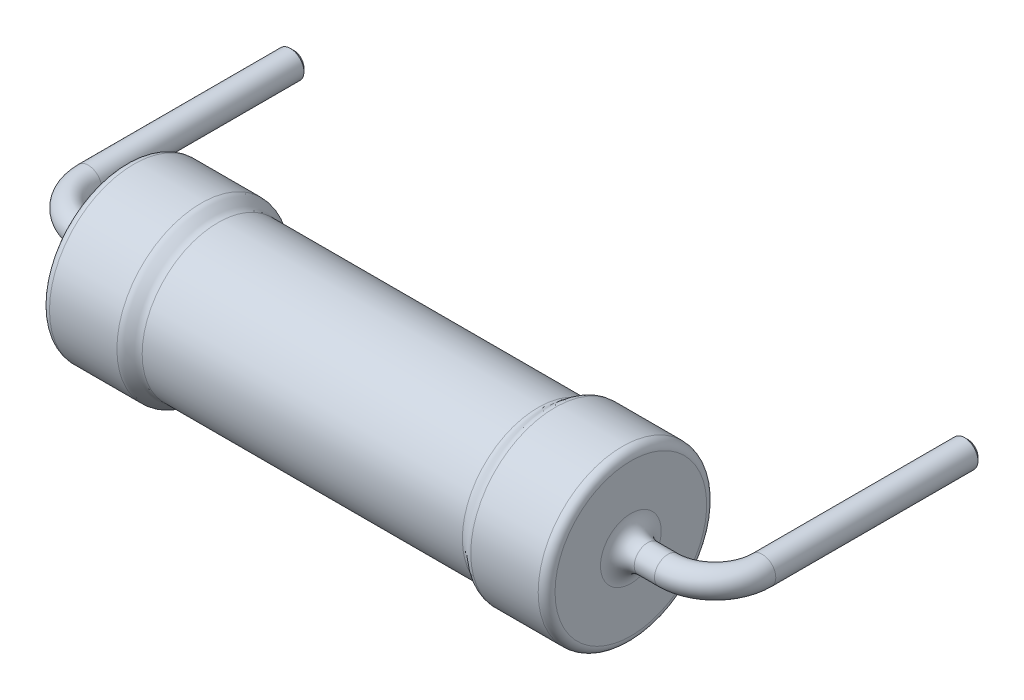
ISO-10303-21;
HEADER;
FILE_DESCRIPTION(('STEP AP214'),'2;1');
FILE_NAME('part.step','',(''),(''),'','','');
FILE_SCHEMA(('AUTOMOTIVE_DESIGN { 1 0 10303 214 1 1 1 1 }'));
ENDSEC;
DATA;
#1=APPLICATION_CONTEXT('core data for automotive mechanical design processes');
#2=APPLICATION_PROTOCOL_DEFINITION('international standard','automotive_design',2000,#1);
#3=PRODUCT_CONTEXT('',#1,'mechanical');
#4=PRODUCT('Part','Part','',(#3));
#5=PRODUCT_RELATED_PRODUCT_CATEGORY('part','',(#4));
#6=PRODUCT_DEFINITION_FORMATION('','',#4);
#7=PRODUCT_DEFINITION_CONTEXT('part definition',#1,'design');
#8=PRODUCT_DEFINITION('design','',#6,#7);
#9=PRODUCT_DEFINITION_SHAPE('','',#8);
#10=(LENGTH_UNIT() NAMED_UNIT(*) SI_UNIT(.MILLI.,.METRE.));
#11=(NAMED_UNIT(*) PLANE_ANGLE_UNIT() SI_UNIT($,.RADIAN.));
#12=(NAMED_UNIT(*) SI_UNIT($,.STERADIAN.) SOLID_ANGLE_UNIT());
#13=UNCERTAINTY_MEASURE_WITH_UNIT(LENGTH_MEASURE(1.E-05),#10,'distance_accuracy_value','');
#14=(GEOMETRIC_REPRESENTATION_CONTEXT(3) GLOBAL_UNCERTAINTY_ASSIGNED_CONTEXT((#13)) GLOBAL_UNIT_ASSIGNED_CONTEXT((#10,
#11,#12)) REPRESENTATION_CONTEXT('',''));
#15=CARTESIAN_POINT('',(0.,0.,0.));
#16=DIRECTION('',(0.,0.,1.));
#17=DIRECTION('',(1.,0.,0.));
#18=AXIS2_PLACEMENT_3D('',#15,#16,#17);
#19=CARTESIAN_POINT('',(8.,0.,4.5));
#20=DIRECTION('',(-1.,0.,0.));
#21=DIRECTION('',(0.,0.,1.));
#22=AXIS2_PLACEMENT_3D('',#19,#20,#21);
#23=TOROIDAL_SURFACE('',#22,0.899999999999999,0.499999999999999);
#24=CARTESIAN_POINT('',(7.5,0.,4.5));
#25=DIRECTION('',(-1.,0.,0.));
#26=DIRECTION('',(0.,0.,1.));
#27=AXIS2_PLACEMENT_3D('',#24,#25,#26);
#28=CIRCLE('',#27,0.9);
#29=CARTESIAN_POINT('',(7.5,0.,5.4));
#30=VERTEX_POINT('',#29);
#31=EDGE_CURVE('E54',#30,#30,#28,.T.);
#32=ORIENTED_EDGE('',*,*,#31,.F.);
#33=EDGE_LOOP('',(#32));
#34=FACE_BOUND('',#33,.T.);
#35=CARTESIAN_POINT('',(8.,0.,4.5));
#36=DIRECTION('',(-1.,0.,0.));
#37=DIRECTION('',(0.,0.,1.));
#38=AXIS2_PLACEMENT_3D('',#35,#36,#37);
#39=CIRCLE('',#38,0.4);
#40=CARTESIAN_POINT('',(8.,0.,4.9));
#41=VERTEX_POINT('',#40);
#42=EDGE_CURVE('E195',#41,#41,#39,.F.);
#43=ORIENTED_EDGE('',*,*,#42,.F.);
#44=EDGE_LOOP('',(#43));
#45=FACE_BOUND('',#44,.T.);
#46=ADVANCED_FACE('F34',(#34,#45),#23,.F.);
#47=CARTESIAN_POINT('',(7.5,0.,3.6));
#48=DIRECTION('',(-1.,0.,0.));
#49=DIRECTION('',(0.,0.,1.));
#50=AXIS2_PLACEMENT_3D('',#47,#48,#49);
#51=PLANE('',#50);
#52=CARTESIAN_POINT('',(7.5,0.,4.5));
#53=DIRECTION('',(-1.,0.,0.));
#54=DIRECTION('',(0.,0.,1.));
#55=AXIS2_PLACEMENT_3D('',#52,#53,#54);
#56=CIRCLE('',#55,2.25);
#57=CARTESIAN_POINT('',(7.5,0.,6.75));
#58=VERTEX_POINT('',#57);
#59=EDGE_CURVE('E62',#58,#58,#56,.T.);
#60=ORIENTED_EDGE('',*,*,#59,.F.);
#61=EDGE_LOOP('',(#60));
#62=FACE_BOUND('',#61,.T.);
#63=ORIENTED_EDGE('',*,*,#31,.T.);
#64=EDGE_LOOP('',(#63));
#65=FACE_BOUND('',#64,.T.);
#66=ADVANCED_FACE('F122',(#62,#65),#51,.F.);
#67=CARTESIAN_POINT('',(7.25,0.,4.5));
#68=DIRECTION('',(-1.,0.,0.));
#69=DIRECTION('',(0.,0.,1.));
#70=AXIS2_PLACEMENT_3D('',#67,#68,#69);
#71=TOROIDAL_SURFACE('',#70,2.25,0.250000000000001);
#72=CARTESIAN_POINT('',(7.25,0.,4.5));
#73=DIRECTION('',(-1.,0.,0.));
#74=DIRECTION('',(0.,0.,1.));
#75=AXIS2_PLACEMENT_3D('',#72,#73,#74);
#76=CIRCLE('',#75,2.5);
#77=CARTESIAN_POINT('',(7.25,0.,7.));
#78=VERTEX_POINT('',#77);
#79=EDGE_CURVE('E65',#78,#78,#76,.T.);
#80=ORIENTED_EDGE('',*,*,#79,.F.);
#81=EDGE_LOOP('',(#80));
#82=FACE_BOUND('',#81,.T.);
#83=ORIENTED_EDGE('',*,*,#59,.T.);
#84=EDGE_LOOP('',(#83));
#85=FACE_BOUND('',#84,.T.);
#86=ADVANCED_FACE('F118',(#82,#85),#71,.T.);
#87=CARTESIAN_POINT('',(-11.456266602372,0.,4.5));
#88=DIRECTION('',(-1.,0.,0.));
#89=DIRECTION('',(0.,0.,1.));
#90=AXIS2_PLACEMENT_3D('',#87,#88,#89);
#91=CYLINDRICAL_SURFACE('',#90,2.5);
#92=CARTESIAN_POINT('',(5.25,0.,4.5));
#93=DIRECTION('',(-1.,0.,0.));
#94=DIRECTION('',(0.,0.,1.));
#95=AXIS2_PLACEMENT_3D('',#92,#93,#94);
#96=CIRCLE('',#95,2.5);
#97=CARTESIAN_POINT('',(5.25,0.,7.));
#98=VERTEX_POINT('',#97);
#99=EDGE_CURVE('E68',#98,#98,#96,.T.);
#100=ORIENTED_EDGE('',*,*,#99,.F.);
#101=EDGE_LOOP('',(#100));
#102=FACE_BOUND('',#101,.T.);
#103=ORIENTED_EDGE('',*,*,#79,.T.);
#104=EDGE_LOOP('',(#103));
#105=FACE_BOUND('',#104,.T.);
#106=ADVANCED_FACE('F114',(#102,#105),#91,.T.);
#107=CARTESIAN_POINT('',(5.25,0.,2.));
#108=CARTESIAN_POINT('',(5.13848377130945,0.,2.));
#109=CARTESIAN_POINT('',(5.00120875504425,0.,2.125));
#110=CARTESIAN_POINT('',(4.85909871860205,0.,2.25));
#111=CARTESIAN_POINT('',(4.75,0.,2.25));
#112=B_SPLINE_CURVE_WITH_KNOTS('',3,(#107,#108,#109,#110,#111),.UNSPECIFIED.,.F.,.F.,(4,1,4),
(0.,0.500000000000001,1.),.UNSPECIFIED.);
#113=CARTESIAN_POINT('',(-11.456266602372,0.,4.5));
#114=DIRECTION('',(-1.,0.,0.));
#115=AXIS1_PLACEMENT('',#113,#114);
#116=SURFACE_OF_REVOLUTION('',#112,#115);
#117=CARTESIAN_POINT('',(4.75,0.,4.5));
#118=DIRECTION('',(-1.,0.,0.));
#119=DIRECTION('',(0.,0.,1.));
#120=AXIS2_PLACEMENT_3D('',#117,#118,#119);
#121=CIRCLE('',#120,2.25);
#122=CARTESIAN_POINT('',(4.75,0.,6.75));
#123=VERTEX_POINT('',#122);
#124=EDGE_CURVE('E71',#123,#123,#121,.T.);
#125=ORIENTED_EDGE('',*,*,#124,.F.);
#126=EDGE_LOOP('',(#125));
#127=FACE_BOUND('',#126,.T.);
#128=ORIENTED_EDGE('',*,*,#99,.T.);
#129=EDGE_LOOP('',(#128));
#130=FACE_BOUND('',#129,.T.);
#131=ADVANCED_FACE('F110',(#127,#130),#116,.T.);
#132=CARTESIAN_POINT('',(-11.456266602372,0.,4.5));
#133=DIRECTION('',(-1.,0.,0.));
#134=DIRECTION('',(0.,0.,1.));
#135=AXIS2_PLACEMENT_3D('',#132,#133,#134);
#136=CYLINDRICAL_SURFACE('',#135,2.25);
#137=CARTESIAN_POINT('',(-4.75,0.,4.5));
#138=DIRECTION('',(-1.,0.,0.));
#139=DIRECTION('',(0.,0.,1.));
#140=AXIS2_PLACEMENT_3D('',#137,#138,#139);
#141=CIRCLE('',#140,2.25);
#142=CARTESIAN_POINT('',(-4.75,0.,6.75));
#143=VERTEX_POINT('',#142);
#144=EDGE_CURVE('E74',#143,#143,#141,.T.);
#145=ORIENTED_EDGE('',*,*,#144,.F.);
#146=EDGE_LOOP('',(#145));
#147=FACE_BOUND('',#146,.T.);
#148=ORIENTED_EDGE('',*,*,#124,.T.);
#149=EDGE_LOOP('',(#148));
#150=FACE_BOUND('',#149,.T.);
#151=ADVANCED_FACE('F105',(#147,#150),#136,.T.);
#152=CARTESIAN_POINT('',(-4.75,0.,2.25));
#153=CARTESIAN_POINT('',(-4.85909871860204,0.,2.25));
#154=CARTESIAN_POINT('',(-5.00120875504425,0.,2.125));
#155=CARTESIAN_POINT('',(-5.13848377130945,0.,2.));
#156=CARTESIAN_POINT('',(-5.25,0.,2.));
#157=B_SPLINE_CURVE_WITH_KNOTS('',3,(#152,#153,#154,#155,#156),.UNSPECIFIED.,.F.,.F.,(4,1,4),
(0.,0.5,1.),.UNSPECIFIED.);
#158=CARTESIAN_POINT('',(-11.456266602372,0.,4.5));
#159=DIRECTION('',(-1.,0.,0.));
#160=AXIS1_PLACEMENT('',#158,#159);
#161=SURFACE_OF_REVOLUTION('',#157,#160);
#162=CARTESIAN_POINT('',(-5.25,0.,4.5));
#163=DIRECTION('',(-1.,0.,0.));
#164=DIRECTION('',(0.,0.,1.));
#165=AXIS2_PLACEMENT_3D('',#162,#163,#164);
#166=CIRCLE('',#165,2.5);
#167=CARTESIAN_POINT('',(-5.25,0.,7.));
#168=VERTEX_POINT('',#167);
#169=EDGE_CURVE('E77',#168,#168,#166,.T.);
#170=ORIENTED_EDGE('',*,*,#169,.F.);
#171=EDGE_LOOP('',(#170));
#172=FACE_BOUND('',#171,.T.);
#173=ORIENTED_EDGE('',*,*,#144,.T.);
#174=EDGE_LOOP('',(#173));
#175=FACE_BOUND('',#174,.T.);
#176=ADVANCED_FACE('F100',(#172,#175),#161,.T.);
#177=CARTESIAN_POINT('',(-11.456266602372,0.,4.5));
#178=DIRECTION('',(-1.,0.,0.));
#179=DIRECTION('',(0.,0.,1.));
#180=AXIS2_PLACEMENT_3D('',#177,#178,#179);
#181=CYLINDRICAL_SURFACE('',#180,2.5);
#182=CARTESIAN_POINT('',(-7.25,0.,4.5));
#183=DIRECTION('',(-1.,0.,0.));
#184=DIRECTION('',(0.,0.,1.));
#185=AXIS2_PLACEMENT_3D('',#182,#183,#184);
#186=CIRCLE('',#185,2.5);
#187=CARTESIAN_POINT('',(-7.25,0.,7.));
#188=VERTEX_POINT('',#187);
#189=EDGE_CURVE('E80',#188,#188,#186,.T.);
#190=ORIENTED_EDGE('',*,*,#189,.F.);
#191=EDGE_LOOP('',(#190));
#192=FACE_BOUND('',#191,.T.);
#193=ORIENTED_EDGE('',*,*,#169,.T.);
#194=EDGE_LOOP('',(#193));
#195=FACE_BOUND('',#194,.T.);
#196=ADVANCED_FACE('F104',(#192,#195),#181,.T.);
#197=CARTESIAN_POINT('',(-7.25,0.,4.5));
#198=DIRECTION('',(-1.,0.,0.));
#199=DIRECTION('',(0.,0.,1.));
#200=AXIS2_PLACEMENT_3D('',#197,#198,#199);
#201=TOROIDAL_SURFACE('',#200,2.25,0.250000000000001);
#202=CARTESIAN_POINT('',(-7.5,0.,4.5));
#203=DIRECTION('',(-1.,0.,0.));
#204=DIRECTION('',(0.,0.,1.));
#205=AXIS2_PLACEMENT_3D('',#202,#203,#204);
#206=CIRCLE('',#205,2.25);
#207=CARTESIAN_POINT('',(-7.5,0.,6.75));
#208=VERTEX_POINT('',#207);
#209=EDGE_CURVE('E83',#208,#208,#206,.T.);
#210=ORIENTED_EDGE('',*,*,#209,.F.);
#211=EDGE_LOOP('',(#210));
#212=FACE_BOUND('',#211,.T.);
#213=ORIENTED_EDGE('',*,*,#189,.T.);
#214=EDGE_LOOP('',(#213));
#215=FACE_BOUND('',#214,.T.);
#216=ADVANCED_FACE('F167',(#212,#215),#201,.T.);
#217=CARTESIAN_POINT('',(-7.5,0.,3.6));
#218=DIRECTION('',(1.,0.,0.));
#219=DIRECTION('',(0.,0.,-1.));
#220=AXIS2_PLACEMENT_3D('',#217,#218,#219);
#221=PLANE('',#220);
#222=CARTESIAN_POINT('',(-7.5,0.,4.5));
#223=DIRECTION('',(-1.,0.,0.));
#224=DIRECTION('',(0.,0.,1.));
#225=AXIS2_PLACEMENT_3D('',#222,#223,#224);
#226=CIRCLE('',#225,0.9);
#227=CARTESIAN_POINT('',(-7.5,0.,5.4));
#228=VERTEX_POINT('',#227);
#229=EDGE_CURVE('E58',#228,#228,#226,.T.);
#230=ORIENTED_EDGE('',*,*,#229,.F.);
#231=EDGE_LOOP('',(#230));
#232=FACE_BOUND('',#231,.T.);
#233=ORIENTED_EDGE('',*,*,#209,.T.);
#234=EDGE_LOOP('',(#233));
#235=FACE_BOUND('',#234,.T.);
#236=ADVANCED_FACE('F161',(#232,#235),#221,.F.);
#237=CARTESIAN_POINT('',(-8.,0.,4.5));
#238=DIRECTION('',(-1.,0.,0.));
#239=DIRECTION('',(0.,0.,1.));
#240=AXIS2_PLACEMENT_3D('',#237,#238,#239);
#241=TOROIDAL_SURFACE('',#240,0.9,0.5);
#242=CARTESIAN_POINT('',(-8.,0.,4.5));
#243=DIRECTION('',(-1.,0.,0.));
#244=DIRECTION('',(0.,0.,1.));
#245=AXIS2_PLACEMENT_3D('',#242,#243,#244);
#246=CIRCLE('',#245,0.4);
#247=CARTESIAN_POINT('',(-8.,0.,4.9));
#248=VERTEX_POINT('',#247);
#249=EDGE_CURVE('E55',#248,#248,#246,.T.);
#250=ORIENTED_EDGE('',*,*,#249,.F.);
#251=EDGE_LOOP('',(#250));
#252=FACE_BOUND('',#251,.T.);
#253=ORIENTED_EDGE('',*,*,#229,.T.);
#254=EDGE_LOOP('',(#253));
#255=FACE_BOUND('',#254,.T.);
#256=ADVANCED_FACE('F145',(#252,#255),#241,.F.);
#257=CARTESIAN_POINT('',(-10.,0.,-3.));
#258=DIRECTION('',(0.,0.,-1.));
#259=DIRECTION('',(-1.,0.,0.));
#260=AXIS2_PLACEMENT_3D('',#257,#258,#259);
#261=PLANE('',#260);
#262=CARTESIAN_POINT('',(-10.,0.,-3.));
#263=DIRECTION('',(0.,0.,-1.));
#264=DIRECTION('',(-1.,0.,0.));
#265=AXIS2_PLACEMENT_3D('',#262,#263,#264);
#266=CIRCLE('',#265,0.300000000000005);
#267=CARTESIAN_POINT('',(-10.3,0.,-3.));
#268=VERTEX_POINT('',#267);
#269=EDGE_CURVE('E49',#268,#268,#266,.T.);
#270=ORIENTED_EDGE('',*,*,#269,.T.);
#271=EDGE_LOOP('',(#270));
#272=FACE_BOUND('',#271,.T.);
#273=ADVANCED_FACE('F135',(#272),#261,.T.);
#274=CARTESIAN_POINT('',(-8.,0.,4.5));
#275=DIRECTION('',(-1.,0.,0.));
#276=DIRECTION('',(0.,0.,1.));
#277=AXIS2_PLACEMENT_3D('',#274,#275,#276);
#278=CYLINDRICAL_SURFACE('',#277,0.4);
#279=CARTESIAN_POINT('',(-8.6,0.,4.5));
#280=DIRECTION('',(-1.,0.,0.));
#281=DIRECTION('',(0.,0.,1.));
#282=AXIS2_PLACEMENT_3D('',#279,#280,#281);
#283=CIRCLE('',#282,0.4);
#284=CARTESIAN_POINT('',(-8.6,0.,4.90000000000001));
#285=VERTEX_POINT('',#284);
#286=EDGE_CURVE('E205',#285,#285,#283,.T.);
#287=ORIENTED_EDGE('',*,*,#286,.F.);
#288=EDGE_LOOP('',(#287));
#289=FACE_BOUND('',#288,.T.);
#290=ORIENTED_EDGE('',*,*,#249,.T.);
#291=EDGE_LOOP('',(#290));
#292=FACE_BOUND('',#291,.T.);
#293=ADVANCED_FACE('F152',(#289,#292),#278,.T.);
#294=CARTESIAN_POINT('',(-8.6,0.,3.1));
#295=DIRECTION('',(0.,-1.,0.));
#296=DIRECTION('',(0.,0.,-1.));
#297=AXIS2_PLACEMENT_3D('',#294,#295,#296);
#298=TOROIDAL_SURFACE('',#297,1.40000000000001,0.4);
#299=CARTESIAN_POINT('',(-10.,0.,3.1));
#300=DIRECTION('',(0.,0.,-1.));
#301=DIRECTION('',(-1.,0.,0.));
#302=AXIS2_PLACEMENT_3D('',#299,#300,#301);
#303=CIRCLE('',#302,0.4);
#304=CARTESIAN_POINT('',(-10.4,0.,3.1));
#305=VERTEX_POINT('',#304);
#306=EDGE_CURVE('E59',#305,#305,#303,.T.);
#307=CARTESIAN_POINT('',(-8.6,0.,3.1));
#308=DIRECTION('',(0.,-1.,0.));
#309=DIRECTION('',(0.,0.,-1.));
#310=AXIS2_PLACEMENT_3D('',#307,#308,#309);
#311=CIRCLE('',#310,1.80000000000001);
#312=EDGE_CURVE('',#285,#305,#311,.T.);
#313=ORIENTED_EDGE('',*,*,#286,.T.);
#314=ORIENTED_EDGE('',*,*,#306,.F.);
#315=ORIENTED_EDGE('',*,*,#312,.T.);
#316=ORIENTED_EDGE('',*,*,#312,.F.);
#317=EDGE_LOOP('',(#313,#315,#314,#316));
#318=FACE_BOUND('',#317,.T.);
#319=ADVANCED_FACE('F142',(#318),#298,.T.);
#320=CARTESIAN_POINT('',(-10.,0.,3.1));
#321=DIRECTION('',(0.,0.,-1.));
#322=DIRECTION('',(-1.,0.,0.));
#323=AXIS2_PLACEMENT_3D('',#320,#321,#322);
#324=CYLINDRICAL_SURFACE('',#323,0.4);
#325=CARTESIAN_POINT('',(-10.,0.,-2.90000000000001));
#326=DIRECTION('',(0.,0.,-1.));
#327=DIRECTION('',(-1.,0.,0.));
#328=AXIS2_PLACEMENT_3D('',#325,#326,#327);
#329=CIRCLE('',#328,0.4);
#330=CARTESIAN_POINT('',(-10.4,0.,-2.90000000000001));
#331=VERTEX_POINT('',#330);
#332=EDGE_CURVE('E45',#331,#331,#329,.F.);
#333=ORIENTED_EDGE('',*,*,#332,.T.);
#334=EDGE_LOOP('',(#333));
#335=FACE_BOUND('',#334,.T.);
#336=ORIENTED_EDGE('',*,*,#306,.T.);
#337=EDGE_LOOP('',(#336));
#338=FACE_BOUND('',#337,.T.);
#339=ADVANCED_FACE('F132',(#335,#338),#324,.T.);
#340=CARTESIAN_POINT('',(-10.,0.,-3.));
#341=DIRECTION('',(0.,0.,1.));
#342=DIRECTION('',(1.,0.,0.));
#343=AXIS2_PLACEMENT_3D('',#340,#341,#342);
#344=CONICAL_SURFACE('',#343,0.300000000000005,0.785398163397458);
#345=ORIENTED_EDGE('',*,*,#332,.F.);
#346=EDGE_LOOP('',(#345));
#347=FACE_BOUND('',#346,.T.);
#348=ORIENTED_EDGE('',*,*,#269,.F.);
#349=EDGE_LOOP('',(#348));
#350=FACE_BOUND('',#349,.T.);
#351=ADVANCED_FACE('F129',(#347,#350),#344,.T.);
#352=CARTESIAN_POINT('',(10.,0.,-3.));
#353=DIRECTION('',(0.,0.,-1.));
#354=DIRECTION('',(1.,0.,0.));
#355=AXIS2_PLACEMENT_3D('',#352,#353,#354);
#356=PLANE('',#355);
#357=CARTESIAN_POINT('',(10.,0.,-3.));
#358=DIRECTION('',(0.,0.,-1.));
#359=DIRECTION('',(-1.,0.,0.));
#360=AXIS2_PLACEMENT_3D('',#357,#358,#359);
#361=CIRCLE('',#360,0.299999999999998);
#362=CARTESIAN_POINT('',(9.7,0.,-3.));
#363=VERTEX_POINT('',#362);
#364=EDGE_CURVE('E41',#363,#363,#361,.T.);
#365=ORIENTED_EDGE('',*,*,#364,.T.);
#366=EDGE_LOOP('',(#365));
#367=FACE_BOUND('',#366,.T.);
#368=ADVANCED_FACE('F131',(#367),#356,.T.);
#369=CARTESIAN_POINT('',(8.,0.,4.5));
#370=DIRECTION('',(1.,0.,0.));
#371=DIRECTION('',(0.,0.,-1.));
#372=AXIS2_PLACEMENT_3D('',#369,#370,#371);
#373=CYLINDRICAL_SURFACE('',#372,0.4);
#374=CARTESIAN_POINT('',(8.6,0.,4.5));
#375=DIRECTION('',(-1.,0.,0.));
#376=DIRECTION('',(0.,0.,1.));
#377=AXIS2_PLACEMENT_3D('',#374,#375,#376);
#378=CIRCLE('',#377,0.4);
#379=CARTESIAN_POINT('',(8.6,0.,4.90000000000001));
#380=VERTEX_POINT('',#379);
#381=EDGE_CURVE('E197',#380,#380,#378,.F.);
#382=ORIENTED_EDGE('',*,*,#381,.F.);
#383=EDGE_LOOP('',(#382));
#384=FACE_BOUND('',#383,.T.);
#385=ORIENTED_EDGE('',*,*,#42,.T.);
#386=EDGE_LOOP('',(#385));
#387=FACE_BOUND('',#386,.T.);
#388=ADVANCED_FACE('F140',(#384,#387),#373,.T.);
#389=CARTESIAN_POINT('',(8.6,0.,3.1));
#390=DIRECTION('',(0.,1.,0.));
#391=DIRECTION('',(0.,0.,1.));
#392=AXIS2_PLACEMENT_3D('',#389,#390,#391);
#393=TOROIDAL_SURFACE('',#392,1.40000000000001,0.4);
#394=CARTESIAN_POINT('',(10.,0.,3.1));
#395=DIRECTION('',(0.,0.,1.));
#396=DIRECTION('',(1.,0.,0.));
#397=AXIS2_PLACEMENT_3D('',#394,#395,#396);
#398=CIRCLE('',#397,0.4);
#399=CARTESIAN_POINT('',(10.4,0.,3.1));
#400=VERTEX_POINT('',#399);
#401=EDGE_CURVE('E200',#400,#400,#398,.F.);
#402=CARTESIAN_POINT('',(8.6,0.,3.1));
#403=DIRECTION('',(0.,1.,0.));
#404=DIRECTION('',(0.,0.,1.));
#405=AXIS2_PLACEMENT_3D('',#402,#403,#404);
#406=CIRCLE('',#405,1.80000000000001);
#407=EDGE_CURVE('',#380,#400,#406,.T.);
#408=ORIENTED_EDGE('',*,*,#381,.T.);
#409=ORIENTED_EDGE('',*,*,#401,.F.);
#410=ORIENTED_EDGE('',*,*,#407,.T.);
#411=ORIENTED_EDGE('',*,*,#407,.F.);
#412=EDGE_LOOP('',(#408,#410,#409,#411));
#413=FACE_BOUND('',#412,.T.);
#414=ADVANCED_FACE('F149',(#413),#393,.T.);
#415=CARTESIAN_POINT('',(10.,0.,3.1));
#416=DIRECTION('',(0.,0.,-1.));
#417=DIRECTION('',(-1.,0.,0.));
#418=AXIS2_PLACEMENT_3D('',#415,#416,#417);
#419=CYLINDRICAL_SURFACE('',#418,0.4);
#420=CARTESIAN_POINT('',(10.,0.,-2.9));
#421=DIRECTION('',(0.,0.,-1.));
#422=DIRECTION('',(-1.,0.,0.));
#423=AXIS2_PLACEMENT_3D('',#420,#421,#422);
#424=CIRCLE('',#423,0.4);
#425=CARTESIAN_POINT('',(9.6,0.,-2.9));
#426=VERTEX_POINT('',#425);
#427=EDGE_CURVE('E10',#426,#426,#424,.F.);
#428=ORIENTED_EDGE('',*,*,#427,.T.);
#429=EDGE_LOOP('',(#428));
#430=FACE_BOUND('',#429,.T.);
#431=ORIENTED_EDGE('',*,*,#401,.T.);
#432=EDGE_LOOP('',(#431));
#433=FACE_BOUND('',#432,.T.);
#434=ADVANCED_FACE('F134',(#430,#433),#419,.T.);
#435=CARTESIAN_POINT('',(10.,0.,-3.));
#436=DIRECTION('',(0.,0.,1.));
#437=DIRECTION('',(1.,0.,0.));
#438=AXIS2_PLACEMENT_3D('',#435,#436,#437);
#439=CONICAL_SURFACE('',#438,0.299999999999998,0.785398163397458);
#440=ORIENTED_EDGE('',*,*,#427,.F.);
#441=EDGE_LOOP('',(#440));
#442=FACE_BOUND('',#441,.T.);
#443=ORIENTED_EDGE('',*,*,#364,.F.);
#444=EDGE_LOOP('',(#443));
#445=FACE_BOUND('',#444,.T.);
#446=ADVANCED_FACE('F36',(#442,#445),#439,.T.);
#447=CLOSED_SHELL('',(#46,#66,#86,#106,#131,#151,#176,#196,#216,#236,#256,#273,#293,#319,#339,
#351,#368,#388,#414,#434,#446));
#448=MANIFOLD_SOLID_BREP('B2',#447);
#449=ADVANCED_BREP_SHAPE_REPRESENTATION('',(#18,#448),#14);
#450=SHAPE_DEFINITION_REPRESENTATION(#9,#449);
ENDSEC;
END-ISO-10303-21;
